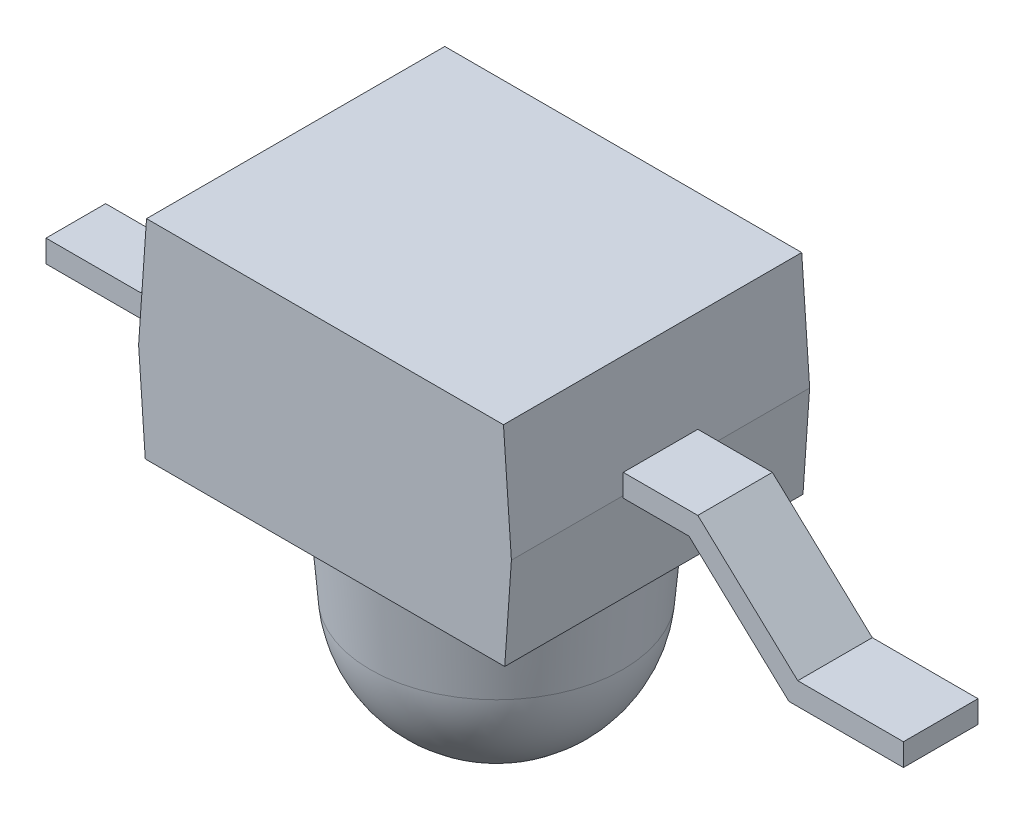
ISO-10303-21;
HEADER;
FILE_DESCRIPTION(('STEP AP214'),'2;1');
FILE_NAME('part.step','',(''),(''),'','','');
FILE_SCHEMA(('AUTOMOTIVE_DESIGN { 1 0 10303 214 1 1 1 1 }'));
ENDSEC;
DATA;
#1=APPLICATION_CONTEXT('core data for automotive mechanical design processes');
#2=APPLICATION_PROTOCOL_DEFINITION('international standard','automotive_design',2000,#1);
#3=PRODUCT_CONTEXT('',#1,'mechanical');
#4=PRODUCT('Part','Part','',(#3));
#5=PRODUCT_RELATED_PRODUCT_CATEGORY('part','',(#4));
#6=PRODUCT_DEFINITION_FORMATION('','',#4);
#7=PRODUCT_DEFINITION_CONTEXT('part definition',#1,'design');
#8=PRODUCT_DEFINITION('design','',#6,#7);
#9=PRODUCT_DEFINITION_SHAPE('','',#8);
#10=(LENGTH_UNIT() NAMED_UNIT(*) SI_UNIT(.MILLI.,.METRE.));
#11=(NAMED_UNIT(*) PLANE_ANGLE_UNIT() SI_UNIT($,.RADIAN.));
#12=(NAMED_UNIT(*) SI_UNIT($,.STERADIAN.) SOLID_ANGLE_UNIT());
#13=UNCERTAINTY_MEASURE_WITH_UNIT(LENGTH_MEASURE(1.E-05),#10,'distance_accuracy_value','');
#14=(GEOMETRIC_REPRESENTATION_CONTEXT(3) GLOBAL_UNCERTAINTY_ASSIGNED_CONTEXT((#13)) GLOBAL_UNIT_ASSIGNED_CONTEXT((#10,
#11,#12)) REPRESENTATION_CONTEXT('',''));
#15=CARTESIAN_POINT('',(0.,0.,0.));
#16=DIRECTION('',(0.,0.,1.));
#17=DIRECTION('',(1.,0.,0.));
#18=AXIS2_PLACEMENT_3D('',#15,#16,#17);
#19=CARTESIAN_POINT('',(-1.25,-5.01088515944044,0.2));
#20=DIRECTION('',(1.,0.,0.));
#21=DIRECTION('',(0.,1.,0.));
#22=AXIS2_PLACEMENT_3D('',#19,#20,#21);
#23=PLANE('',#22);
#24=DIRECTION('',(0.,-1.,0.));
#25=VECTOR('',#24,1.);
#26=CARTESIAN_POINT('',(-1.25,-5.01088515944044,-0.2));
#27=LINE('',#26,#25);
#28=CARTESIAN_POINT('',(-1.25,0.0749999999999995,-0.2));
#29=VERTEX_POINT('',#28);
#30=CARTESIAN_POINT('',(-1.25,-0.0749999999999995,-0.2));
#31=VERTEX_POINT('',#30);
#32=EDGE_CURVE('E126',#29,#31,#27,.T.);
#33=ORIENTED_EDGE('',*,*,#32,.F.);
#34=DIRECTION('',(0.,0.,-1.));
#35=VECTOR('',#34,1.);
#36=CARTESIAN_POINT('',(-1.25,0.0749999999999995,0.2));
#37=LINE('',#36,#35);
#38=CARTESIAN_POINT('',(-1.25,0.0749999999999995,0.2));
#39=VERTEX_POINT('',#38);
#40=EDGE_CURVE('E12',#39,#29,#37,.T.);
#41=ORIENTED_EDGE('',*,*,#40,.F.);
#42=DIRECTION('',(0.,-1.,0.));
#43=VECTOR('',#42,1.);
#44=CARTESIAN_POINT('',(-1.25,-5.01088515944044,0.2));
#45=LINE('',#44,#43);
#46=CARTESIAN_POINT('',(-1.25,-0.0749999999999995,0.2));
#47=VERTEX_POINT('',#46);
#48=EDGE_CURVE('E146',#39,#47,#45,.T.);
#49=ORIENTED_EDGE('',*,*,#48,.T.);
#50=DIRECTION('',(0.,0.,-1.));
#51=VECTOR('',#50,1.);
#52=CARTESIAN_POINT('',(-1.25,-0.0749999999999995,0.2));
#53=LINE('',#52,#51);
#54=EDGE_CURVE('E62',#47,#31,#53,.T.);
#55=ORIENTED_EDGE('',*,*,#54,.T.);
#56=EDGE_LOOP('',(#33,#41,#49,#55));
#57=FACE_BOUND('',#56,.T.);
#58=ADVANCED_FACE('F48',(#57),#23,.T.);
#59=CARTESIAN_POINT('',(0.244800005128151,0.0749999999999995,0.2));
#60=DIRECTION('',(0.,-1.,0.));
#61=DIRECTION('',(1.,0.,0.));
#62=AXIS2_PLACEMENT_3D('',#59,#60,#61);
#63=PLANE('',#62);
#64=DIRECTION('',(-1.,0.,0.));
#65=VECTOR('',#64,1.);
#66=CARTESIAN_POINT('',(0.244800005128151,0.0749999999999995,-0.2));
#67=LINE('',#66,#65);
#68=CARTESIAN_POINT('',(-1.36685562292294,0.075,-0.2));
#69=VERTEX_POINT('',#68);
#70=EDGE_CURVE('E115',#29,#69,#67,.T.);
#71=ORIENTED_EDGE('',*,*,#70,.T.);
#72=DIRECTION('',(0.,0.,-1.));
#73=VECTOR('',#72,1.);
#74=CARTESIAN_POINT('',(-1.36685562292294,0.075,0.2));
#75=LINE('',#74,#73);
#76=CARTESIAN_POINT('',(-1.36685562292294,0.075,0.2));
#77=VERTEX_POINT('',#76);
#78=EDGE_CURVE('E55',#77,#69,#75,.T.);
#79=ORIENTED_EDGE('',*,*,#78,.F.);
#80=DIRECTION('',(-1.,0.,0.));
#81=VECTOR('',#80,1.);
#82=CARTESIAN_POINT('',(0.244800005128151,0.0749999999999995,0.2));
#83=LINE('',#82,#81);
#84=EDGE_CURVE('E117',#39,#77,#83,.T.);
#85=ORIENTED_EDGE('',*,*,#84,.F.);
#86=ORIENTED_EDGE('',*,*,#40,.T.);
#87=EDGE_LOOP('',(#71,#79,#85,#86));
#88=FACE_BOUND('',#87,.T.);
#89=ADVANCED_FACE('F113',(#88),#63,.F.);
#90=CARTESIAN_POINT('',(-3.04156420154991,-1.48669101445381,0.2));
#91=DIRECTION('',(0.681998360062499,-0.73135370161917,0.));
#92=DIRECTION('',(0.73135370161917,0.681998360062499,0.));
#93=AXIS2_PLACEMENT_3D('',#90,#91,#92);
#94=PLANE('',#93);
#95=DIRECTION('',(-0.73135370161917,-0.681998360062499,0.));
#96=VECTOR('',#95,1.);
#97=CARTESIAN_POINT('',(-3.04156420154991,-1.48669101445381,-0.2));
#98=LINE('',#97,#96);
#99=CARTESIAN_POINT('',(-2.03708606668836,-0.55,-0.2));
#100=VERTEX_POINT('',#99);
#101=EDGE_CURVE('E128',#69,#100,#98,.T.);
#102=ORIENTED_EDGE('',*,*,#101,.T.);
#103=DIRECTION('',(0.,0.,-1.));
#104=VECTOR('',#103,1.);
#105=CARTESIAN_POINT('',(-2.03708606668836,-0.55,0.2));
#106=LINE('',#105,#104);
#107=CARTESIAN_POINT('',(-2.03708606668836,-0.55,0.2));
#108=VERTEX_POINT('',#107);
#109=EDGE_CURVE('E171',#108,#100,#106,.T.);
#110=ORIENTED_EDGE('',*,*,#109,.F.);
#111=DIRECTION('',(-0.73135370161917,-0.681998360062499,0.));
#112=VECTOR('',#111,1.);
#113=CARTESIAN_POINT('',(-3.04156420154991,-1.48669101445381,0.2));
#114=LINE('',#113,#112);
#115=EDGE_CURVE('E149',#77,#108,#114,.T.);
#116=ORIENTED_EDGE('',*,*,#115,.F.);
#117=ORIENTED_EDGE('',*,*,#78,.T.);
#118=EDGE_LOOP('',(#102,#110,#116,#117));
#119=FACE_BOUND('',#118,.T.);
#120=ADVANCED_FACE('F175',(#119),#94,.F.);
#121=CARTESIAN_POINT('',(0.24480000512815,-0.550000000000001,0.2));
#122=DIRECTION('',(0.,-1.,0.));
#123=DIRECTION('',(1.,0.,0.));
#124=AXIS2_PLACEMENT_3D('',#121,#122,#123);
#125=PLANE('',#124);
#126=DIRECTION('',(-1.,0.,0.));
#127=VECTOR('',#126,1.);
#128=CARTESIAN_POINT('',(0.24480000512815,-0.550000000000001,-0.2));
#129=LINE('',#128,#127);
#130=CARTESIAN_POINT('',(-2.67099682330428,-0.550000000000002,-0.2));
#131=VERTEX_POINT('',#130);
#132=EDGE_CURVE('E133',#100,#131,#129,.T.);
#133=ORIENTED_EDGE('',*,*,#132,.T.);
#134=DIRECTION('',(0.,0.,-1.));
#135=VECTOR('',#134,1.);
#136=CARTESIAN_POINT('',(-2.67099682330428,-0.550000000000002,0.2));
#137=LINE('',#136,#135);
#138=CARTESIAN_POINT('',(-2.67099682330428,-0.550000000000002,0.2));
#139=VERTEX_POINT('',#138);
#140=EDGE_CURVE('E168',#139,#131,#137,.T.);
#141=ORIENTED_EDGE('',*,*,#140,.F.);
#142=DIRECTION('',(-1.,0.,0.));
#143=VECTOR('',#142,1.);
#144=CARTESIAN_POINT('',(0.24480000512815,-0.550000000000001,0.2));
#145=LINE('',#144,#143);
#146=EDGE_CURVE('E151',#108,#139,#145,.T.);
#147=ORIENTED_EDGE('',*,*,#146,.F.);
#148=ORIENTED_EDGE('',*,*,#109,.T.);
#149=EDGE_LOOP('',(#133,#141,#147,#148));
#150=FACE_BOUND('',#149,.T.);
#151=ADVANCED_FACE('F194',(#150),#125,.F.);
#152=CARTESIAN_POINT('',(-2.67099682330428,-5.01088515944044,0.2));
#153=DIRECTION('',(1.,0.,0.));
#154=DIRECTION('',(0.,0.,-1.));
#155=AXIS2_PLACEMENT_3D('',#152,#153,#154);
#156=PLANE('',#155);
#157=DIRECTION('',(0.,-1.,0.));
#158=VECTOR('',#157,1.);
#159=CARTESIAN_POINT('',(-2.67099682330428,-5.01088515944044,-0.2));
#160=LINE('',#159,#158);
#161=CARTESIAN_POINT('',(-2.67099682330428,-0.700000000000001,-0.2));
#162=VERTEX_POINT('',#161);
#163=EDGE_CURVE('E135',#131,#162,#160,.T.);
#164=ORIENTED_EDGE('',*,*,#163,.T.);
#165=DIRECTION('',(0.,0.,-1.));
#166=VECTOR('',#165,1.);
#167=CARTESIAN_POINT('',(-2.67099682330428,-0.700000000000001,0.2));
#168=LINE('',#167,#166);
#169=CARTESIAN_POINT('',(-2.67099682330428,-0.700000000000001,0.2));
#170=VERTEX_POINT('',#169);
#171=EDGE_CURVE('E166',#170,#162,#168,.T.);
#172=ORIENTED_EDGE('',*,*,#171,.F.);
#173=DIRECTION('',(0.,-1.,0.));
#174=VECTOR('',#173,1.);
#175=CARTESIAN_POINT('',(-2.67099682330428,-5.01088515944044,0.2));
#176=LINE('',#175,#174);
#177=EDGE_CURVE('E153',#139,#170,#176,.T.);
#178=ORIENTED_EDGE('',*,*,#177,.F.);
#179=ORIENTED_EDGE('',*,*,#140,.T.);
#180=EDGE_LOOP('',(#164,#172,#178,#179));
#181=FACE_BOUND('',#180,.T.);
#182=ADVANCED_FACE('F192',(#181),#156,.F.);
#183=CARTESIAN_POINT('',(0.24480000512815,-0.7,0.2));
#184=DIRECTION('',(0.,-1.,0.));
#185=DIRECTION('',(1.,0.,0.));
#186=AXIS2_PLACEMENT_3D('',#183,#184,#185);
#187=PLANE('',#186);
#188=DIRECTION('',(-1.,0.,0.));
#189=VECTOR('',#188,1.);
#190=CARTESIAN_POINT('',(0.24480000512815,-0.7,-0.2));
#191=LINE('',#190,#189);
#192=CARTESIAN_POINT('',(-1.97799949534612,-0.7,-0.2));
#193=VERTEX_POINT('',#192);
#194=EDGE_CURVE('E138',#193,#162,#191,.T.);
#195=ORIENTED_EDGE('',*,*,#194,.F.);
#196=DIRECTION('',(0.,0.,-1.));
#197=VECTOR('',#196,1.);
#198=CARTESIAN_POINT('',(-1.97799949534612,-0.7,0.2));
#199=LINE('',#198,#197);
#200=CARTESIAN_POINT('',(-1.97799949534612,-0.7,0.2));
#201=VERTEX_POINT('',#200);
#202=EDGE_CURVE('E164',#201,#193,#199,.T.);
#203=ORIENTED_EDGE('',*,*,#202,.F.);
#204=DIRECTION('',(-1.,0.,0.));
#205=VECTOR('',#204,1.);
#206=CARTESIAN_POINT('',(0.24480000512815,-0.7,0.2));
#207=LINE('',#206,#205);
#208=EDGE_CURVE('E155',#201,#170,#207,.T.);
#209=ORIENTED_EDGE('',*,*,#208,.T.);
#210=ORIENTED_EDGE('',*,*,#171,.T.);
#211=EDGE_LOOP('',(#195,#203,#209,#210));
#212=FACE_BOUND('',#211,.T.);
#213=ADVANCED_FACE('F188',(#212),#187,.T.);
#214=CARTESIAN_POINT('',(-2.93926444754053,-1.59639406969669,0.2));
#215=DIRECTION('',(0.6819983600625,-0.731353701619169,0.));
#216=DIRECTION('',(0.731353701619169,0.6819983600625,0.));
#217=AXIS2_PLACEMENT_3D('',#214,#215,#216);
#218=PLANE('',#217);
#219=DIRECTION('',(-0.731353701619169,-0.6819983600625,0.));
#220=VECTOR('',#219,1.);
#221=CARTESIAN_POINT('',(-2.93926444754053,-1.59639406969669,-0.2));
#222=LINE('',#221,#220);
#223=CARTESIAN_POINT('',(-1.3077690515807,-0.0750000000000002,-0.2));
#224=VERTEX_POINT('',#223);
#225=EDGE_CURVE('E141',#224,#193,#222,.T.);
#226=ORIENTED_EDGE('',*,*,#225,.F.);
#227=DIRECTION('',(0.,0.,-1.));
#228=VECTOR('',#227,1.);
#229=CARTESIAN_POINT('',(-1.3077690515807,-0.0750000000000002,0.2));
#230=LINE('',#229,#228);
#231=CARTESIAN_POINT('',(-1.3077690515807,-0.0750000000000002,0.2));
#232=VERTEX_POINT('',#231);
#233=EDGE_CURVE('E70',#232,#224,#230,.T.);
#234=ORIENTED_EDGE('',*,*,#233,.F.);
#235=DIRECTION('',(-0.731353701619169,-0.6819983600625,0.));
#236=VECTOR('',#235,1.);
#237=CARTESIAN_POINT('',(-2.93926444754053,-1.59639406969669,0.2));
#238=LINE('',#237,#236);
#239=EDGE_CURVE('E158',#232,#201,#238,.T.);
#240=ORIENTED_EDGE('',*,*,#239,.T.);
#241=ORIENTED_EDGE('',*,*,#202,.T.);
#242=EDGE_LOOP('',(#226,#234,#240,#241));
#243=FACE_BOUND('',#242,.T.);
#244=ADVANCED_FACE('F184',(#243),#218,.T.);
#245=CARTESIAN_POINT('',(0.244800005128137,-0.0749999999999952,0.2));
#246=DIRECTION('',(0.,-1.,0.));
#247=DIRECTION('',(1.,0.,0.));
#248=AXIS2_PLACEMENT_3D('',#245,#246,#247);
#249=PLANE('',#248);
#250=DIRECTION('',(-1.,0.,0.));
#251=VECTOR('',#250,1.);
#252=CARTESIAN_POINT('',(0.244800005128137,-0.0749999999999952,-0.2));
#253=LINE('',#252,#251);
#254=EDGE_CURVE('E144',#31,#224,#253,.T.);
#255=ORIENTED_EDGE('',*,*,#254,.F.);
#256=ORIENTED_EDGE('',*,*,#54,.F.);
#257=DIRECTION('',(-1.,0.,0.));
#258=VECTOR('',#257,1.);
#259=CARTESIAN_POINT('',(0.244800005128137,-0.0749999999999952,0.2));
#260=LINE('',#259,#258);
#261=EDGE_CURVE('E160',#47,#232,#260,.T.);
#262=ORIENTED_EDGE('',*,*,#261,.T.);
#263=ORIENTED_EDGE('',*,*,#233,.T.);
#264=EDGE_LOOP('',(#255,#256,#262,#263));
#265=FACE_BOUND('',#264,.T.);
#266=ADVANCED_FACE('F183',(#265),#249,.T.);
#267=CARTESIAN_POINT('',(0.244800005128151,-5.01088515944044,0.2));
#268=DIRECTION('',(0.,0.,1.));
#269=DIRECTION('',(1.,0.,0.));
#270=AXIS2_PLACEMENT_3D('',#267,#268,#269);
#271=PLANE('',#270);
#272=ORIENTED_EDGE('',*,*,#48,.F.);
#273=ORIENTED_EDGE('',*,*,#84,.T.);
#274=ORIENTED_EDGE('',*,*,#115,.T.);
#275=ORIENTED_EDGE('',*,*,#146,.T.);
#276=ORIENTED_EDGE('',*,*,#177,.T.);
#277=ORIENTED_EDGE('',*,*,#208,.F.);
#278=ORIENTED_EDGE('',*,*,#239,.F.);
#279=ORIENTED_EDGE('',*,*,#261,.F.);
#280=EDGE_LOOP('',(#272,#273,#274,#275,#276,#277,#278,#279));
#281=FACE_BOUND('',#280,.T.);
#282=ADVANCED_FACE('F179',(#281),#271,.T.);
#283=CARTESIAN_POINT('',(0.244800005128151,-5.01088515944044,-0.2));
#284=DIRECTION('',(0.,0.,1.));
#285=DIRECTION('',(1.,0.,0.));
#286=AXIS2_PLACEMENT_3D('',#283,#284,#285);
#287=PLANE('',#286);
#288=ORIENTED_EDGE('',*,*,#32,.T.);
#289=ORIENTED_EDGE('',*,*,#254,.T.);
#290=ORIENTED_EDGE('',*,*,#225,.T.);
#291=ORIENTED_EDGE('',*,*,#194,.T.);
#292=ORIENTED_EDGE('',*,*,#163,.F.);
#293=ORIENTED_EDGE('',*,*,#132,.F.);
#294=ORIENTED_EDGE('',*,*,#101,.F.);
#295=ORIENTED_EDGE('',*,*,#70,.F.);
#296=EDGE_LOOP('',(#288,#289,#290,#291,#292,#293,#294,#295));
#297=FACE_BOUND('',#296,.T.);
#298=ADVANCED_FACE('F124',(#297),#287,.F.);
#299=CLOSED_SHELL('',(#58,#89,#120,#151,#182,#213,#244,#266,#282,#298));
#300=MANIFOLD_SOLID_BREP('B2',#299);
#301=CARTESIAN_POINT('',(3.48164938000698,-1.53978917075744,0.25));
#302=DIRECTION('',(0.6819983600625,0.731353701619169,0.));
#303=DIRECTION('',(-0.731353701619169,0.6819983600625,0.));
#304=AXIS2_PLACEMENT_3D('',#301,#302,#303);
#305=PLANE('',#304);
#306=DIRECTION('',(0.731353701619169,-0.6819983600625,0.));
#307=VECTOR('',#306,1.);
#308=CARTESIAN_POINT('',(3.48164938000698,-1.53978917075744,-0.25));
#309=LINE('',#308,#307);
#310=CARTESIAN_POINT('',(1.75,0.0750000000000004,-0.25));
#311=VERTEX_POINT('',#310);
#312=CARTESIAN_POINT('',(2.42023044376543,-0.550000000000001,-0.25));
#313=VERTEX_POINT('',#312);
#314=EDGE_CURVE('E365',#311,#313,#309,.T.);
#315=ORIENTED_EDGE('',*,*,#314,.F.);
#316=DIRECTION('',(0.,0.,-1.));
#317=VECTOR('',#316,1.);
#318=CARTESIAN_POINT('',(1.75,0.0750000000000004,0.25));
#319=LINE('',#318,#317);
#320=CARTESIAN_POINT('',(1.75,0.0750000000000004,0.25));
#321=VERTEX_POINT('',#320);
#322=EDGE_CURVE('E46',#321,#311,#319,.T.);
#323=ORIENTED_EDGE('',*,*,#322,.F.);
#324=DIRECTION('',(0.731353701619169,-0.6819983600625,0.));
#325=VECTOR('',#324,1.);
#326=CARTESIAN_POINT('',(3.48164938000698,-1.53978917075744,0.25));
#327=LINE('',#326,#325);
#328=CARTESIAN_POINT('',(2.42023044376543,-0.550000000000001,0.25));
#329=VERTEX_POINT('',#328);
#330=EDGE_CURVE('E388',#321,#329,#327,.T.);
#331=ORIENTED_EDGE('',*,*,#330,.T.);
#332=DIRECTION('',(0.,0.,-1.));
#333=VECTOR('',#332,1.);
#334=CARTESIAN_POINT('',(2.42023044376543,-0.550000000000001,0.25));
#335=LINE('',#334,#333);
#336=EDGE_CURVE('E305',#329,#313,#335,.T.);
#337=ORIENTED_EDGE('',*,*,#336,.T.);
#338=EDGE_LOOP('',(#315,#323,#331,#337));
#339=FACE_BOUND('',#338,.T.);
#340=ADVANCED_FACE('F291',(#339),#305,.T.);
#341=CARTESIAN_POINT('',(0.244800005128151,0.0750000000000004,0.25));
#342=DIRECTION('',(0.,1.,0.));
#343=DIRECTION('',(0.,0.,1.));
#344=AXIS2_PLACEMENT_3D('',#341,#342,#343);
#345=PLANE('',#344);
#346=DIRECTION('',(1.,0.,0.));
#347=VECTOR('',#346,1.);
#348=CARTESIAN_POINT('',(0.244800005128151,0.0750000000000004,-0.25));
#349=LINE('',#348,#347);
#350=CARTESIAN_POINT('',(1.25,0.0750000000000004,-0.25));
#351=VERTEX_POINT('',#350);
#352=EDGE_CURVE('E359',#351,#311,#349,.T.);
#353=ORIENTED_EDGE('',*,*,#352,.F.);
#354=DIRECTION('',(0.,0.,-1.));
#355=VECTOR('',#354,1.);
#356=CARTESIAN_POINT('',(1.25,0.0750000000000004,0.25));
#357=LINE('',#356,#355);
#358=CARTESIAN_POINT('',(1.25,0.0750000000000004,0.25));
#359=VERTEX_POINT('',#358);
#360=EDGE_CURVE('E298',#359,#351,#357,.T.);
#361=ORIENTED_EDGE('',*,*,#360,.F.);
#362=DIRECTION('',(1.,0.,0.));
#363=VECTOR('',#362,1.);
#364=CARTESIAN_POINT('',(0.244800005128151,0.0750000000000004,0.25));
#365=LINE('',#364,#363);
#366=EDGE_CURVE('E361',#359,#321,#365,.T.);
#367=ORIENTED_EDGE('',*,*,#366,.T.);
#368=ORIENTED_EDGE('',*,*,#322,.T.);
#369=EDGE_LOOP('',(#353,#361,#367,#368));
#370=FACE_BOUND('',#369,.T.);
#371=ADVANCED_FACE('F357',(#370),#345,.T.);
#372=CARTESIAN_POINT('',(1.25,-5.01088515944044,0.25));
#373=DIRECTION('',(1.,0.,0.));
#374=DIRECTION('',(0.,1.,0.));
#375=AXIS2_PLACEMENT_3D('',#372,#373,#374);
#376=PLANE('',#375);
#377=DIRECTION('',(0.,-1.,0.));
#378=VECTOR('',#377,1.);
#379=CARTESIAN_POINT('',(1.25,-5.01088515944044,-0.25));
#380=LINE('',#379,#378);
#381=CARTESIAN_POINT('',(1.25,-0.0750000000000004,-0.25));
#382=VERTEX_POINT('',#381);
#383=EDGE_CURVE('E372',#351,#382,#380,.T.);
#384=ORIENTED_EDGE('',*,*,#383,.T.);
#385=DIRECTION('',(0.,0.,-1.));
#386=VECTOR('',#385,1.);
#387=CARTESIAN_POINT('',(1.25,-0.0750000000000004,0.25));
#388=LINE('',#387,#386);
#389=CARTESIAN_POINT('',(1.25,-0.0750000000000004,0.25));
#390=VERTEX_POINT('',#389);
#391=EDGE_CURVE('E413',#390,#382,#388,.T.);
#392=ORIENTED_EDGE('',*,*,#391,.F.);
#393=DIRECTION('',(0.,-1.,0.));
#394=VECTOR('',#393,1.);
#395=CARTESIAN_POINT('',(1.25,-5.01088515944044,0.25));
#396=LINE('',#395,#394);
#397=EDGE_CURVE('E391',#359,#390,#396,.T.);
#398=ORIENTED_EDGE('',*,*,#397,.F.);
#399=ORIENTED_EDGE('',*,*,#360,.T.);
#400=EDGE_LOOP('',(#384,#392,#398,#399));
#401=FACE_BOUND('',#400,.T.);
#402=ADVANCED_FACE('F417',(#401),#376,.F.);
#403=CARTESIAN_POINT('',(0.244800005128151,-0.0750000000000004,0.25));
#404=DIRECTION('',(0.,1.,0.));
#405=DIRECTION('',(0.,0.,1.));
#406=AXIS2_PLACEMENT_3D('',#403,#404,#405);
#407=PLANE('',#406);
#408=DIRECTION('',(1.,0.,0.));
#409=VECTOR('',#408,1.);
#410=CARTESIAN_POINT('',(0.244800005128151,-0.0750000000000004,-0.25));
#411=LINE('',#410,#409);
#412=CARTESIAN_POINT('',(1.69091342865776,-0.0750000000000004,-0.25));
#413=VERTEX_POINT('',#412);
#414=EDGE_CURVE('E374',#382,#413,#411,.T.);
#415=ORIENTED_EDGE('',*,*,#414,.T.);
#416=DIRECTION('',(0.,0.,-1.));
#417=VECTOR('',#416,1.);
#418=CARTESIAN_POINT('',(1.69091342865776,-0.0750000000000004,0.25));
#419=LINE('',#418,#417);
#420=CARTESIAN_POINT('',(1.69091342865776,-0.0750000000000004,0.25));
#421=VERTEX_POINT('',#420);
#422=EDGE_CURVE('E410',#421,#413,#419,.T.);
#423=ORIENTED_EDGE('',*,*,#422,.F.);
#424=DIRECTION('',(1.,0.,0.));
#425=VECTOR('',#424,1.);
#426=CARTESIAN_POINT('',(0.244800005128151,-0.0750000000000004,0.25));
#427=LINE('',#426,#425);
#428=EDGE_CURVE('E393',#390,#421,#427,.T.);
#429=ORIENTED_EDGE('',*,*,#428,.F.);
#430=ORIENTED_EDGE('',*,*,#391,.T.);
#431=EDGE_LOOP('',(#415,#423,#429,#430));
#432=FACE_BOUND('',#431,.T.);
#433=ADVANCED_FACE('F437',(#432),#407,.F.);
#434=CARTESIAN_POINT('',(3.37934962599761,-1.64949222600032,0.25));
#435=DIRECTION('',(0.6819983600625,0.731353701619169,0.));
#436=DIRECTION('',(-0.731353701619169,0.6819983600625,0.));
#437=AXIS2_PLACEMENT_3D('',#434,#435,#436);
#438=PLANE('',#437);
#439=DIRECTION('',(0.731353701619169,-0.6819983600625,0.));
#440=VECTOR('',#439,1.);
#441=CARTESIAN_POINT('',(3.37934962599761,-1.64949222600032,-0.25));
#442=LINE('',#441,#440);
#443=CARTESIAN_POINT('',(2.36114387242318,-0.7,-0.25));
#444=VERTEX_POINT('',#443);
#445=EDGE_CURVE('E378',#413,#444,#442,.T.);
#446=ORIENTED_EDGE('',*,*,#445,.T.);
#447=DIRECTION('',(0.,0.,-1.));
#448=VECTOR('',#447,1.);
#449=CARTESIAN_POINT('',(2.36114387242318,-0.7,0.25));
#450=LINE('',#449,#448);
#451=CARTESIAN_POINT('',(2.36114387242318,-0.7,0.25));
#452=VERTEX_POINT('',#451);
#453=EDGE_CURVE('E407',#452,#444,#450,.T.);
#454=ORIENTED_EDGE('',*,*,#453,.F.);
#455=DIRECTION('',(0.731353701619169,-0.6819983600625,0.));
#456=VECTOR('',#455,1.);
#457=CARTESIAN_POINT('',(3.37934962599761,-1.64949222600032,0.25));
#458=LINE('',#457,#456);
#459=EDGE_CURVE('E395',#421,#452,#458,.T.);
#460=ORIENTED_EDGE('',*,*,#459,.F.);
#461=ORIENTED_EDGE('',*,*,#422,.T.);
#462=EDGE_LOOP('',(#446,#454,#460,#461));
#463=FACE_BOUND('',#462,.T.);
#464=ADVANCED_FACE('F434',(#463),#438,.F.);
#465=CARTESIAN_POINT('',(0.244800005128151,-0.7,0.25));
#466=DIRECTION('',(0.,1.,0.));
#467=DIRECTION('',(0.,0.,1.));
#468=AXIS2_PLACEMENT_3D('',#465,#466,#467);
#469=PLANE('',#468);
#470=DIRECTION('',(1.,0.,0.));
#471=VECTOR('',#470,1.);
#472=CARTESIAN_POINT('',(0.244800005128151,-0.7,-0.25));
#473=LINE('',#472,#471);
#474=CARTESIAN_POINT('',(3.12900317669572,-0.7,-0.25));
#475=VERTEX_POINT('',#474);
#476=EDGE_CURVE('E380',#444,#475,#473,.T.);
#477=ORIENTED_EDGE('',*,*,#476,.T.);
#478=DIRECTION('',(0.,0.,-1.));
#479=VECTOR('',#478,1.);
#480=CARTESIAN_POINT('',(3.12900317669572,-0.7,0.25));
#481=LINE('',#480,#479);
#482=CARTESIAN_POINT('',(3.12900317669572,-0.7,0.25));
#483=VERTEX_POINT('',#482);
#484=EDGE_CURVE('E405',#483,#475,#481,.T.);
#485=ORIENTED_EDGE('',*,*,#484,.F.);
#486=DIRECTION('',(1.,0.,0.));
#487=VECTOR('',#486,1.);
#488=CARTESIAN_POINT('',(0.244800005128151,-0.7,0.25));
#489=LINE('',#488,#487);
#490=EDGE_CURVE('E397',#452,#483,#489,.T.);
#491=ORIENTED_EDGE('',*,*,#490,.F.);
#492=ORIENTED_EDGE('',*,*,#453,.T.);
#493=EDGE_LOOP('',(#477,#485,#491,#492));
#494=FACE_BOUND('',#493,.T.);
#495=ADVANCED_FACE('F429',(#494),#469,.F.);
#496=CARTESIAN_POINT('',(3.12900317669572,-5.01088515944044,0.25));
#497=DIRECTION('',(1.,0.,0.));
#498=DIRECTION('',(0.,0.,-1.));
#499=AXIS2_PLACEMENT_3D('',#496,#497,#498);
#500=PLANE('',#499);
#501=DIRECTION('',(0.,-1.,0.));
#502=VECTOR('',#501,1.);
#503=CARTESIAN_POINT('',(3.12900317669572,-5.01088515944044,-0.25));
#504=LINE('',#503,#502);
#505=CARTESIAN_POINT('',(3.12900317669572,-0.550000000000001,-0.25));
#506=VERTEX_POINT('',#505);
#507=EDGE_CURVE('E383',#506,#475,#504,.T.);
#508=ORIENTED_EDGE('',*,*,#507,.F.);
#509=DIRECTION('',(0.,0.,-1.));
#510=VECTOR('',#509,1.);
#511=CARTESIAN_POINT('',(3.12900317669572,-0.550000000000001,0.25));
#512=LINE('',#511,#510);
#513=CARTESIAN_POINT('',(3.12900317669572,-0.550000000000001,0.25));
#514=VERTEX_POINT('',#513);
#515=EDGE_CURVE('E313',#514,#506,#512,.T.);
#516=ORIENTED_EDGE('',*,*,#515,.F.);
#517=DIRECTION('',(0.,-1.,0.));
#518=VECTOR('',#517,1.);
#519=CARTESIAN_POINT('',(3.12900317669572,-5.01088515944044,0.25));
#520=LINE('',#519,#518);
#521=EDGE_CURVE('E399',#514,#483,#520,.T.);
#522=ORIENTED_EDGE('',*,*,#521,.T.);
#523=ORIENTED_EDGE('',*,*,#484,.T.);
#524=EDGE_LOOP('',(#508,#516,#522,#523));
#525=FACE_BOUND('',#524,.T.);
#526=ADVANCED_FACE('F424',(#525),#500,.T.);
#527=CARTESIAN_POINT('',(0.244800005128151,-0.550000000000001,0.25));
#528=DIRECTION('',(0.,1.,0.));
#529=DIRECTION('',(0.,0.,1.));
#530=AXIS2_PLACEMENT_3D('',#527,#528,#529);
#531=PLANE('',#530);
#532=DIRECTION('',(1.,0.,0.));
#533=VECTOR('',#532,1.);
#534=CARTESIAN_POINT('',(0.244800005128151,-0.550000000000001,-0.25));
#535=LINE('',#534,#533);
#536=EDGE_CURVE('E386',#313,#506,#535,.T.);
#537=ORIENTED_EDGE('',*,*,#536,.F.);
#538=ORIENTED_EDGE('',*,*,#336,.F.);
#539=DIRECTION('',(1.,0.,0.));
#540=VECTOR('',#539,1.);
#541=CARTESIAN_POINT('',(0.244800005128151,-0.550000000000001,0.25));
#542=LINE('',#541,#540);
#543=EDGE_CURVE('E401',#329,#514,#542,.T.);
#544=ORIENTED_EDGE('',*,*,#543,.T.);
#545=ORIENTED_EDGE('',*,*,#515,.T.);
#546=EDGE_LOOP('',(#537,#538,#544,#545));
#547=FACE_BOUND('',#546,.T.);
#548=ADVANCED_FACE('F423',(#547),#531,.T.);
#549=CARTESIAN_POINT('',(0.244800005128151,-5.01088515944044,0.25));
#550=DIRECTION('',(0.,0.,1.));
#551=DIRECTION('',(1.,0.,0.));
#552=AXIS2_PLACEMENT_3D('',#549,#550,#551);
#553=PLANE('',#552);
#554=ORIENTED_EDGE('',*,*,#330,.F.);
#555=ORIENTED_EDGE('',*,*,#366,.F.);
#556=ORIENTED_EDGE('',*,*,#397,.T.);
#557=ORIENTED_EDGE('',*,*,#428,.T.);
#558=ORIENTED_EDGE('',*,*,#459,.T.);
#559=ORIENTED_EDGE('',*,*,#490,.T.);
#560=ORIENTED_EDGE('',*,*,#521,.F.);
#561=ORIENTED_EDGE('',*,*,#543,.F.);
#562=EDGE_LOOP('',(#554,#555,#556,#557,#558,#559,#560,#561));
#563=FACE_BOUND('',#562,.T.);
#564=ADVANCED_FACE('F421',(#563),#553,.T.);
#565=CARTESIAN_POINT('',(0.244800005128151,-5.01088515944044,-0.25));
#566=DIRECTION('',(0.,0.,1.));
#567=DIRECTION('',(1.,0.,0.));
#568=AXIS2_PLACEMENT_3D('',#565,#566,#567);
#569=PLANE('',#568);
#570=ORIENTED_EDGE('',*,*,#314,.T.);
#571=ORIENTED_EDGE('',*,*,#536,.T.);
#572=ORIENTED_EDGE('',*,*,#507,.T.);
#573=ORIENTED_EDGE('',*,*,#476,.F.);
#574=ORIENTED_EDGE('',*,*,#445,.F.);
#575=ORIENTED_EDGE('',*,*,#414,.F.);
#576=ORIENTED_EDGE('',*,*,#383,.F.);
#577=ORIENTED_EDGE('',*,*,#352,.T.);
#578=EDGE_LOOP('',(#570,#571,#572,#573,#574,#575,#576,#577));
#579=FACE_BOUND('',#578,.T.);
#580=ADVANCED_FACE('F370',(#579),#569,.F.);
#581=CLOSED_SHELL('',(#340,#371,#402,#433,#464,#495,#526,#548,#564,#580));
#582=MANIFOLD_SOLID_BREP('B6',#581);
#583=CARTESIAN_POINT('',(0.244800005128151,-0.7,1.));
#584=DIRECTION('',(0.,1.,0.));
#585=DIRECTION('',(-1.,0.,0.));
#586=AXIS2_PLACEMENT_3D('',#583,#584,#585);
#587=PLANE('',#586);
#588=DIRECTION('',(1.,0.,0.));
#589=VECTOR('',#588,1.);
#590=CARTESIAN_POINT('',(0.244800005128151,-0.7,-1.));
#591=LINE('',#590,#589);
#592=CARTESIAN_POINT('',(-1.20524684035615,-0.7,-1.));
#593=VERTEX_POINT('',#592);
#594=CARTESIAN_POINT('',(1.20524684035615,-0.7,-1.));
#595=VERTEX_POINT('',#594);
#596=EDGE_CURVE('E598',#593,#595,#591,.T.);
#597=ORIENTED_EDGE('',*,*,#596,.T.);
#598=DIRECTION('',(0.,0.,-1.));
#599=VECTOR('',#598,1.);
#600=CARTESIAN_POINT('',(1.20524684035615,-0.7,1.));
#601=LINE('',#600,#599);
#602=CARTESIAN_POINT('',(1.20524684035615,-0.7,1.));
#603=VERTEX_POINT('',#602);
#604=EDGE_CURVE('E629',#603,#595,#601,.T.);
#605=ORIENTED_EDGE('',*,*,#604,.F.);
#606=DIRECTION('',(1.,0.,0.));
#607=VECTOR('',#606,1.);
#608=CARTESIAN_POINT('',(0.244800005128151,-0.7,1.));
#609=LINE('',#608,#607);
#610=CARTESIAN_POINT('',(-1.20524684035615,-0.7,1.));
#611=VERTEX_POINT('',#610);
#612=EDGE_CURVE('E616',#611,#603,#609,.T.);
#613=ORIENTED_EDGE('',*,*,#612,.F.);
#614=DIRECTION('',(0.,0.,-1.));
#615=VECTOR('',#614,1.);
#616=CARTESIAN_POINT('',(-1.20524684035615,-0.7,1.));
#617=LINE('',#616,#615);
#618=EDGE_CURVE('E589',#611,#593,#617,.T.);
#619=ORIENTED_EDGE('',*,*,#618,.T.);
#620=EDGE_LOOP('',(#597,#605,#613,#619));
#621=FACE_BOUND('',#620,.T.);
#622=CARTESIAN_POINT('',(0.15,-0.7,0.));
#623=DIRECTION('',(0.,1.,0.));
#624=DIRECTION('',(-1.,0.,0.));
#625=AXIS2_PLACEMENT_3D('',#622,#623,#624);
#626=CIRCLE('',#625,0.9);
#627=CARTESIAN_POINT('',(-0.75,-0.7,0.));
#628=VERTEX_POINT('',#627);
#629=EDGE_CURVE('E289',#628,#628,#626,.F.);
#630=ORIENTED_EDGE('',*,*,#629,.F.);
#631=EDGE_LOOP('',(#630));
#632=FACE_BOUND('',#631,.T.);
#633=ADVANCED_FACE('F525',(#621,#632),#587,.F.);
#634=CARTESIAN_POINT('',(-1.58724137462071,-4.88277634640603,1.));
#635=DIRECTION('',(-0.997564050259825,0.0697564737441182,0.));
#636=DIRECTION('',(-0.0697564737441182,-0.997564050259825,0.));
#637=AXIS2_PLACEMENT_3D('',#634,#635,#636);
#638=PLANE('',#637);
#639=DIRECTION('',(0.0697564737441182,0.997564050259825,0.));
#640=VECTOR('',#639,1.);
#641=CARTESIAN_POINT('',(-1.58724137462071,-4.88277634640603,-1.));
#642=LINE('',#641,#640);
#643=CARTESIAN_POINT('',(-1.25,-0.0600000000000054,-1.));
#644=VERTEX_POINT('',#643);
#645=CARTESIAN_POINT('',(-1.19685562292294,0.700000000000001,-1.));
#646=VERTEX_POINT('',#645);
#647=EDGE_CURVE('E595',#644,#646,#642,.T.);
#648=ORIENTED_EDGE('',*,*,#647,.F.);
#649=DIRECTION('',(0.,0.,-1.));
#650=VECTOR('',#649,1.);
#651=CARTESIAN_POINT('',(-1.25,-0.0600000000000054,1.));
#652=LINE('',#651,#650);
#653=CARTESIAN_POINT('',(-1.25,-0.0600000000000054,1.));
#654=VERTEX_POINT('',#653);
#655=EDGE_CURVE('E533',#654,#644,#652,.T.);
#656=ORIENTED_EDGE('',*,*,#655,.F.);
#657=DIRECTION('',(0.0697564737441182,0.997564050259825,0.));
#658=VECTOR('',#657,1.);
#659=CARTESIAN_POINT('',(-1.58724137462071,-4.88277634640603,1.));
#660=LINE('',#659,#658);
#661=CARTESIAN_POINT('',(-1.19685562292294,0.700000000000001,1.));
#662=VERTEX_POINT('',#661);
#663=EDGE_CURVE('E613',#654,#662,#660,.T.);
#664=ORIENTED_EDGE('',*,*,#663,.T.);
#665=DIRECTION('',(0.,0.,-1.));
#666=VECTOR('',#665,1.);
#667=CARTESIAN_POINT('',(-1.19685562292294,0.700000000000001,1.));
#668=LINE('',#667,#666);
#669=EDGE_CURVE('E540',#662,#646,#668,.T.);
#670=ORIENTED_EDGE('',*,*,#669,.T.);
#671=EDGE_LOOP('',(#648,#656,#664,#670));
#672=FACE_BOUND('',#671,.T.);
#673=ADVANCED_FACE('F527',(#672),#638,.T.);
#674=CARTESIAN_POINT('',(-0.898211334484247,-5.09081229843482,1.));
#675=DIRECTION('',(0.997564050259824,0.0697564737441258,0.));
#676=DIRECTION('',(-0.0697564737441258,0.997564050259824,0.));
#677=AXIS2_PLACEMENT_3D('',#674,#675,#676);
#678=PLANE('',#677);
#679=DIRECTION('',(0.0697564737441257,-0.997564050259824,0.));
#680=VECTOR('',#679,1.);
#681=CARTESIAN_POINT('',(-0.898211334484247,-5.09081229843482,-1.));
#682=LINE('',#681,#680);
#683=EDGE_CURVE('E583',#644,#593,#682,.T.);
#684=ORIENTED_EDGE('',*,*,#683,.T.);
#685=ORIENTED_EDGE('',*,*,#618,.F.);
#686=DIRECTION('',(0.0697564737441257,-0.997564050259824,0.));
#687=VECTOR('',#686,1.);
#688=CARTESIAN_POINT('',(-0.898211334484247,-5.09081229843482,1.));
#689=LINE('',#688,#687);
#690=EDGE_CURVE('E585',#654,#611,#689,.T.);
#691=ORIENTED_EDGE('',*,*,#690,.F.);
#692=ORIENTED_EDGE('',*,*,#655,.T.);
#693=EDGE_LOOP('',(#684,#685,#691,#692));
#694=FACE_BOUND('',#693,.T.);
#695=ADVANCED_FACE('F581',(#694),#678,.F.);
#696=CARTESIAN_POINT('',(0.900593711306217,-5.0567427226061,1.));
#697=DIRECTION('',(0.997564050259824,-0.0697564737441258,0.));
#698=DIRECTION('',(0.0697564737441258,0.997564050259824,0.));
#699=AXIS2_PLACEMENT_3D('',#696,#697,#698);
#700=PLANE('',#699);
#701=DIRECTION('',(-0.0697564737441257,-0.997564050259824,0.));
#702=VECTOR('',#701,1.);
#703=CARTESIAN_POINT('',(0.900593711306217,-5.0567427226061,-1.));
#704=LINE('',#703,#702);
#705=CARTESIAN_POINT('',(1.25,-0.0599999999999958,-1.));
#706=VERTEX_POINT('',#705);
#707=EDGE_CURVE('E606',#706,#595,#704,.T.);
#708=ORIENTED_EDGE('',*,*,#707,.F.);
#709=DIRECTION('',(0.,0.,-1.));
#710=VECTOR('',#709,1.);
#711=CARTESIAN_POINT('',(1.25,-0.0599999999999958,1.));
#712=LINE('',#711,#710);
#713=CARTESIAN_POINT('',(1.25,-0.0599999999999958,1.));
#714=VERTEX_POINT('',#713);
#715=EDGE_CURVE('E627',#714,#706,#712,.T.);
#716=ORIENTED_EDGE('',*,*,#715,.F.);
#717=DIRECTION('',(-0.0697564737441257,-0.997564050259824,0.));
#718=VECTOR('',#717,1.);
#719=CARTESIAN_POINT('',(0.900593711306217,-5.0567427226061,1.));
#720=LINE('',#719,#718);
#721=EDGE_CURVE('E618',#714,#603,#720,.T.);
#722=ORIENTED_EDGE('',*,*,#721,.T.);
#723=ORIENTED_EDGE('',*,*,#604,.T.);
#724=EDGE_LOOP('',(#708,#716,#722,#723));
#725=FACE_BOUND('',#724,.T.);
#726=ADVANCED_FACE('F642',(#725),#700,.T.);
#727=CARTESIAN_POINT('',(1.58962375144268,-4.91684592223475,1.));
#728=DIRECTION('',(-0.997564050259825,-0.0697564737441182,0.));
#729=DIRECTION('',(0.0697564737441182,-0.997564050259825,0.));
#730=AXIS2_PLACEMENT_3D('',#727,#728,#729);
#731=PLANE('',#730);
#732=DIRECTION('',(-0.0697564737441182,0.997564050259825,0.));
#733=VECTOR('',#732,1.);
#734=CARTESIAN_POINT('',(1.58962375144268,-4.91684592223475,-1.));
#735=LINE('',#734,#733);
#736=CARTESIAN_POINT('',(1.19685562292294,0.700000000000001,-1.));
#737=VERTEX_POINT('',#736);
#738=EDGE_CURVE('E608',#706,#737,#735,.T.);
#739=ORIENTED_EDGE('',*,*,#738,.T.);
#740=DIRECTION('',(0.,0.,-1.));
#741=VECTOR('',#740,1.);
#742=CARTESIAN_POINT('',(1.19685562292294,0.700000000000001,1.));
#743=LINE('',#742,#741);
#744=CARTESIAN_POINT('',(1.19685562292294,0.700000000000001,1.));
#745=VERTEX_POINT('',#744);
#746=EDGE_CURVE('E625',#745,#737,#743,.T.);
#747=ORIENTED_EDGE('',*,*,#746,.F.);
#748=DIRECTION('',(-0.0697564737441182,0.997564050259825,0.));
#749=VECTOR('',#748,1.);
#750=CARTESIAN_POINT('',(1.58962375144268,-4.91684592223475,1.));
#751=LINE('',#750,#749);
#752=EDGE_CURVE('E548',#714,#745,#751,.T.);
#753=ORIENTED_EDGE('',*,*,#752,.F.);
#754=ORIENTED_EDGE('',*,*,#715,.T.);
#755=EDGE_LOOP('',(#739,#747,#753,#754));
#756=FACE_BOUND('',#755,.T.);
#757=ADVANCED_FACE('F639',(#756),#731,.F.);
#758=CARTESIAN_POINT('',(0.244800005128151,0.7,1.));
#759=DIRECTION('',(0.,1.,0.));
#760=DIRECTION('',(0.,0.,1.));
#761=AXIS2_PLACEMENT_3D('',#758,#759,#760);
#762=PLANE('',#761);
#763=DIRECTION('',(1.,0.,0.));
#764=VECTOR('',#763,1.);
#765=CARTESIAN_POINT('',(0.244800005128151,0.7,-1.));
#766=LINE('',#765,#764);
#767=EDGE_CURVE('E611',#646,#737,#766,.T.);
#768=ORIENTED_EDGE('',*,*,#767,.F.);
#769=ORIENTED_EDGE('',*,*,#669,.F.);
#770=DIRECTION('',(1.,0.,0.));
#771=VECTOR('',#770,1.);
#772=CARTESIAN_POINT('',(0.244800005128151,0.7,1.));
#773=LINE('',#772,#771);
#774=EDGE_CURVE('E622',#662,#745,#773,.T.);
#775=ORIENTED_EDGE('',*,*,#774,.T.);
#776=ORIENTED_EDGE('',*,*,#746,.T.);
#777=EDGE_LOOP('',(#768,#769,#775,#776));
#778=FACE_BOUND('',#777,.T.);
#779=ADVANCED_FACE('F636',(#778),#762,.T.);
#780=CARTESIAN_POINT('',(0.244800005128151,-5.01088515944044,1.));
#781=DIRECTION('',(0.,0.,1.));
#782=DIRECTION('',(1.,0.,0.));
#783=AXIS2_PLACEMENT_3D('',#780,#781,#782);
#784=PLANE('',#783);
#785=ORIENTED_EDGE('',*,*,#663,.F.);
#786=ORIENTED_EDGE('',*,*,#690,.T.);
#787=ORIENTED_EDGE('',*,*,#612,.T.);
#788=ORIENTED_EDGE('',*,*,#721,.F.);
#789=ORIENTED_EDGE('',*,*,#752,.T.);
#790=ORIENTED_EDGE('',*,*,#774,.F.);
#791=EDGE_LOOP('',(#785,#786,#787,#788,#789,#790));
#792=FACE_BOUND('',#791,.T.);
#793=ADVANCED_FACE('F635',(#792),#784,.T.);
#794=CARTESIAN_POINT('',(0.244800005128151,-5.01088515944044,-1.));
#795=DIRECTION('',(0.,0.,1.));
#796=DIRECTION('',(1.,0.,0.));
#797=AXIS2_PLACEMENT_3D('',#794,#795,#796);
#798=PLANE('',#797);
#799=ORIENTED_EDGE('',*,*,#647,.T.);
#800=ORIENTED_EDGE('',*,*,#767,.T.);
#801=ORIENTED_EDGE('',*,*,#738,.F.);
#802=ORIENTED_EDGE('',*,*,#707,.T.);
#803=ORIENTED_EDGE('',*,*,#596,.F.);
#804=ORIENTED_EDGE('',*,*,#683,.F.);
#805=EDGE_LOOP('',(#799,#800,#801,#802,#803,#804));
#806=FACE_BOUND('',#805,.T.);
#807=ADVANCED_FACE('F593',(#806),#798,.F.);
#808=CARTESIAN_POINT('',(0.15,-1.25,0.));
#809=DIRECTION('',(0.,1.,0.));
#810=DIRECTION('',(1.,0.,0.));
#811=AXIS2_PLACEMENT_3D('',#808,#809,#810);
#812=SPHERICAL_SURFACE('',#811,0.85);
#813=CARTESIAN_POINT('',(0.15,-1.32224031179998,0.));
#814=DIRECTION('',(0.,1.,0.));
#815=DIRECTION('',(-1.,0.,0.));
#816=AXIS2_PLACEMENT_3D('',#813,#814,#815);
#817=CIRCLE('',#816,0.846924634988877);
#818=CARTESIAN_POINT('',(-0.696924634988876,-1.32224031179998,0.));
#819=VERTEX_POINT('',#818);
#820=EDGE_CURVE('E600',#819,#819,#817,.T.);
#821=ORIENTED_EDGE('',*,*,#820,.F.);
#822=EDGE_LOOP('',(#821));
#823=FACE_BOUND('',#822,.T.);
#824=ADVANCED_FACE('F698',(#823),#812,.T.);
#825=CARTESIAN_POINT('',(0.15,-1.32224031179998,0.));
#826=DIRECTION('',(0.,1.,0.));
#827=DIRECTION('',(-1.,0.,0.));
#828=AXIS2_PLACEMENT_3D('',#825,#826,#827);
#829=CONICAL_SURFACE('',#828,0.846924634988877,0.0850912491077595);
#830=ORIENTED_EDGE('',*,*,#629,.T.);
#831=EDGE_LOOP('',(#830));
#832=FACE_BOUND('',#831,.T.);
#833=ORIENTED_EDGE('',*,*,#820,.T.);
#834=EDGE_LOOP('',(#833));
#835=FACE_BOUND('',#834,.T.);
#836=ADVANCED_FACE('F714',(#832,#835),#829,.T.);
#837=CLOSED_SHELL('',(#633,#673,#695,#726,#757,#779,#793,#807,#824,#836));
#838=MANIFOLD_SOLID_BREP('B40',#837);
#839=ADVANCED_BREP_SHAPE_REPRESENTATION('',(#18,#300,#582,#838),#14);
#840=SHAPE_DEFINITION_REPRESENTATION(#9,#839);
ENDSEC;
END-ISO-10303-21;
